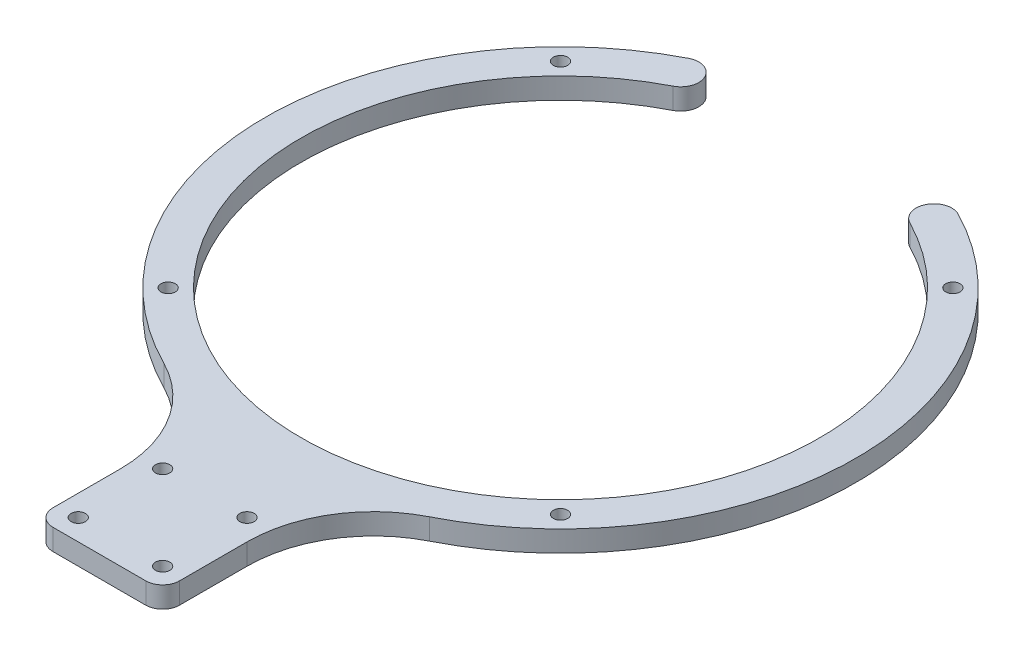
ISO-10303-21;
HEADER;
FILE_DESCRIPTION(('STEP AP214'),'2;1');
FILE_NAME('part.step','',(''),(''),'','','');
FILE_SCHEMA(('AUTOMOTIVE_DESIGN { 1 0 10303 214 1 1 1 1 }'));
ENDSEC;
DATA;
#1=APPLICATION_CONTEXT('core data for automotive mechanical design processes');
#2=APPLICATION_PROTOCOL_DEFINITION('international standard','automotive_design',2000,#1);
#3=PRODUCT_CONTEXT('',#1,'mechanical');
#4=PRODUCT('Part','Part','',(#3));
#5=PRODUCT_RELATED_PRODUCT_CATEGORY('part','',(#4));
#6=PRODUCT_DEFINITION_FORMATION('','',#4);
#7=PRODUCT_DEFINITION_CONTEXT('part definition',#1,'design');
#8=PRODUCT_DEFINITION('design','',#6,#7);
#9=PRODUCT_DEFINITION_SHAPE('','',#8);
#10=(LENGTH_UNIT() NAMED_UNIT(*) SI_UNIT(.MILLI.,.METRE.));
#11=(NAMED_UNIT(*) PLANE_ANGLE_UNIT() SI_UNIT($,.RADIAN.));
#12=(NAMED_UNIT(*) SI_UNIT($,.STERADIAN.) SOLID_ANGLE_UNIT());
#13=UNCERTAINTY_MEASURE_WITH_UNIT(LENGTH_MEASURE(1.E-05),#10,'distance_accuracy_value','');
#14=(GEOMETRIC_REPRESENTATION_CONTEXT(3) GLOBAL_UNCERTAINTY_ASSIGNED_CONTEXT((#13)) GLOBAL_UNIT_ASSIGNED_CONTEXT((#10,
#11,#12)) REPRESENTATION_CONTEXT('',''));
#15=CARTESIAN_POINT('',(0.,0.,0.));
#16=DIRECTION('',(0.,0.,1.));
#17=DIRECTION('',(1.,0.,0.));
#18=AXIS2_PLACEMENT_3D('',#15,#16,#17);
#19=CARTESIAN_POINT('',(-45.,0.,89.3028554974587));
#20=DIRECTION('',(0.,-1.,0.));
#21=DIRECTION('',(0.,0.,-1.));
#22=AXIS2_PLACEMENT_3D('',#19,#20,#21);
#23=PLANE('',#22);
#24=CARTESIAN_POINT('',(46.5,0.,-46.5));
#25=DIRECTION('',(0.,1.,0.));
#26=DIRECTION('',(0.,0.,1.));
#27=AXIS2_PLACEMENT_3D('',#24,#25,#26);
#28=CIRCLE('',#27,1.7);
#29=CARTESIAN_POINT('',(46.5,0.,-44.8));
#30=VERTEX_POINT('',#29);
#31=EDGE_CURVE('E298',#30,#30,#28,.T.);
#32=ORIENTED_EDGE('',*,*,#31,.T.);
#33=EDGE_LOOP('',(#32));
#34=FACE_BOUND('',#33,.T.);
#35=CARTESIAN_POINT('',(46.5,0.,46.5));
#36=DIRECTION('',(0.,1.,0.));
#37=DIRECTION('',(0.,0.,1.));
#38=AXIS2_PLACEMENT_3D('',#35,#36,#37);
#39=CIRCLE('',#38,1.7);
#40=CARTESIAN_POINT('',(46.5,0.,48.2));
#41=VERTEX_POINT('',#40);
#42=EDGE_CURVE('E308',#41,#41,#39,.T.);
#43=ORIENTED_EDGE('',*,*,#42,.T.);
#44=EDGE_LOOP('',(#43));
#45=FACE_BOUND('',#44,.T.);
#46=CARTESIAN_POINT('',(-46.5,0.,46.5));
#47=DIRECTION('',(0.,1.,0.));
#48=DIRECTION('',(0.,0.,1.));
#49=AXIS2_PLACEMENT_3D('',#46,#47,#48);
#50=CIRCLE('',#49,1.7);
#51=CARTESIAN_POINT('',(-46.5,0.,48.2));
#52=VERTEX_POINT('',#51);
#53=EDGE_CURVE('E314',#52,#52,#50,.T.);
#54=ORIENTED_EDGE('',*,*,#53,.T.);
#55=EDGE_LOOP('',(#54));
#56=FACE_BOUND('',#55,.T.);
#57=CARTESIAN_POINT('',(-46.5,0.,-46.5));
#58=DIRECTION('',(0.,1.,0.));
#59=DIRECTION('',(0.,0.,1.));
#60=AXIS2_PLACEMENT_3D('',#57,#58,#59);
#61=CIRCLE('',#60,1.7);
#62=CARTESIAN_POINT('',(-46.5,0.,-44.8));
#63=VERTEX_POINT('',#62);
#64=EDGE_CURVE('E320',#63,#63,#61,.T.);
#65=ORIENTED_EDGE('',*,*,#64,.T.);
#66=EDGE_LOOP('',(#65));
#67=FACE_BOUND('',#66,.T.);
#68=CARTESIAN_POINT('',(-10.,0.,84.3028554974587));
#69=DIRECTION('',(0.,1.,0.));
#70=DIRECTION('',(0.,0.,1.));
#71=AXIS2_PLACEMENT_3D('',#68,#69,#70);
#72=CIRCLE('',#71,1.7);
#73=CARTESIAN_POINT('',(-10.,0.,86.0028554974587));
#74=VERTEX_POINT('',#73);
#75=EDGE_CURVE('E326',#74,#74,#72,.T.);
#76=ORIENTED_EDGE('',*,*,#75,.T.);
#77=EDGE_LOOP('',(#76));
#78=FACE_BOUND('',#77,.T.);
#79=CARTESIAN_POINT('',(10.,0.,84.3028554974587));
#80=DIRECTION('',(0.,1.,0.));
#81=DIRECTION('',(0.,0.,1.));
#82=AXIS2_PLACEMENT_3D('',#79,#80,#81);
#83=CIRCLE('',#82,1.7);
#84=CARTESIAN_POINT('',(10.,0.,86.0028554974587));
#85=VERTEX_POINT('',#84);
#86=EDGE_CURVE('E332',#85,#85,#83,.T.);
#87=ORIENTED_EDGE('',*,*,#86,.T.);
#88=EDGE_LOOP('',(#87));
#89=FACE_BOUND('',#88,.T.);
#90=CARTESIAN_POINT('',(10.,0.,104.302855497459));
#91=DIRECTION('',(0.,1.,0.));
#92=DIRECTION('',(0.,0.,1.));
#93=AXIS2_PLACEMENT_3D('',#90,#91,#92);
#94=CIRCLE('',#93,1.7);
#95=CARTESIAN_POINT('',(10.,0.,106.002855497459));
#96=VERTEX_POINT('',#95);
#97=EDGE_CURVE('E338',#96,#96,#94,.T.);
#98=ORIENTED_EDGE('',*,*,#97,.T.);
#99=EDGE_LOOP('',(#98));
#100=FACE_BOUND('',#99,.T.);
#101=CARTESIAN_POINT('',(-45.,0.,89.3028554974587));
#102=DIRECTION('',(0.,-1.,0.));
#103=DIRECTION('',(0.,0.,-1.));
#104=AXIS2_PLACEMENT_3D('',#101,#102,#103);
#105=CIRCLE('',#104,30.);
#106=CARTESIAN_POINT('',(-31.5,0.,62.5119988482211));
#107=VERTEX_POINT('',#106);
#108=CARTESIAN_POINT('',(-15.,0.,89.3028554974587));
#109=VERTEX_POINT('',#108);
#110=EDGE_CURVE('E153',#107,#109,#105,.T.);
#111=ORIENTED_EDGE('',*,*,#110,.F.);
#112=CARTESIAN_POINT('',(0.,0.,0.));
#113=DIRECTION('',(0.,1.,0.));
#114=DIRECTION('',(0.,0.,1.));
#115=AXIS2_PLACEMENT_3D('',#112,#113,#114);
#116=CIRCLE('',#115,70.);
#117=CARTESIAN_POINT('',(-31.934306569343,0.,-62.2912519053455));
#118=VERTEX_POINT('',#117);
#119=EDGE_CURVE('E96',#118,#107,#116,.T.);
#120=ORIENTED_EDGE('',*,*,#119,.F.);
#121=CARTESIAN_POINT('',(-30.,0.,-58.518181789936));
#122=DIRECTION('',(0.,1.,0.));
#123=DIRECTION('',(0.,0.,-1.));
#124=AXIS2_PLACEMENT_3D('',#121,#122,#123);
#125=CIRCLE('',#124,4.24000000000001);
#126=CARTESIAN_POINT('',(-28.0656934306569,0.,-54.7451116745265));
#127=VERTEX_POINT('',#126);
#128=EDGE_CURVE('E90',#127,#118,#125,.T.);
#129=ORIENTED_EDGE('',*,*,#128,.F.);
#130=CARTESIAN_POINT('',(0.,0.,0.));
#131=DIRECTION('',(0.,-1.,0.));
#132=DIRECTION('',(0.,0.,-1.));
#133=AXIS2_PLACEMENT_3D('',#130,#131,#132);
#134=CIRCLE('',#133,61.52);
#135=CARTESIAN_POINT('',(28.0656934306569,0.,-54.7451116745265));
#136=VERTEX_POINT('',#135);
#137=EDGE_CURVE('E143',#136,#127,#134,.T.);
#138=ORIENTED_EDGE('',*,*,#137,.F.);
#139=CARTESIAN_POINT('',(30.,0.,-58.518181789936));
#140=DIRECTION('',(0.,1.,0.));
#141=DIRECTION('',(0.,0.,-1.));
#142=AXIS2_PLACEMENT_3D('',#139,#140,#141);
#143=CIRCLE('',#142,4.24000000000001);
#144=CARTESIAN_POINT('',(31.9343065693431,0.,-62.2912519053455));
#145=VERTEX_POINT('',#144);
#146=EDGE_CURVE('E171',#145,#136,#143,.T.);
#147=ORIENTED_EDGE('',*,*,#146,.F.);
#148=CARTESIAN_POINT('',(0.,0.,0.));
#149=DIRECTION('',(0.,1.,0.));
#150=DIRECTION('',(0.,0.,-1.));
#151=AXIS2_PLACEMENT_3D('',#148,#149,#150);
#152=CIRCLE('',#151,70.);
#153=CARTESIAN_POINT('',(31.5,0.,62.5119988482211));
#154=VERTEX_POINT('',#153);
#155=EDGE_CURVE('E169',#154,#145,#152,.T.);
#156=ORIENTED_EDGE('',*,*,#155,.F.);
#157=CARTESIAN_POINT('',(45.,0.,89.3028554974587));
#158=DIRECTION('',(0.,-1.,0.));
#159=DIRECTION('',(0.,0.,1.));
#160=AXIS2_PLACEMENT_3D('',#157,#158,#159);
#161=CIRCLE('',#160,30.);
#162=CARTESIAN_POINT('',(15.,0.,89.3028554974587));
#163=VERTEX_POINT('',#162);
#164=EDGE_CURVE('E167',#163,#154,#161,.T.);
#165=ORIENTED_EDGE('',*,*,#164,.F.);
#166=DIRECTION('',(0.,0.,-1.));
#167=VECTOR('',#166,1.);
#168=CARTESIAN_POINT('',(15.,0.,89.3028554974587));
#169=LINE('',#168,#167);
#170=CARTESIAN_POINT('',(15.,0.,105.302855497459));
#171=VERTEX_POINT('',#170);
#172=EDGE_CURVE('E165',#171,#163,#169,.T.);
#173=ORIENTED_EDGE('',*,*,#172,.F.);
#174=CARTESIAN_POINT('',(11.,0.,105.302855497459));
#175=DIRECTION('',(0.,1.,0.));
#176=DIRECTION('',(0.,0.,-1.));
#177=AXIS2_PLACEMENT_3D('',#174,#175,#176);
#178=CIRCLE('',#177,4.00000000000001);
#179=CARTESIAN_POINT('',(11.,0.,109.302855497459));
#180=VERTEX_POINT('',#179);
#181=EDGE_CURVE('E163',#180,#171,#178,.T.);
#182=ORIENTED_EDGE('',*,*,#181,.F.);
#183=DIRECTION('',(1.,0.,0.));
#184=VECTOR('',#183,1.);
#185=CARTESIAN_POINT('',(11.,0.,109.302855497459));
#186=LINE('',#185,#184);
#187=CARTESIAN_POINT('',(-11.,0.,109.302855497459));
#188=VERTEX_POINT('',#187);
#189=EDGE_CURVE('E161',#188,#180,#186,.T.);
#190=ORIENTED_EDGE('',*,*,#189,.F.);
#191=CARTESIAN_POINT('',(-11.,0.,105.302855497459));
#192=DIRECTION('',(0.,1.,0.));
#193=DIRECTION('',(0.,0.,1.));
#194=AXIS2_PLACEMENT_3D('',#191,#192,#193);
#195=CIRCLE('',#194,4.);
#196=CARTESIAN_POINT('',(-15.,0.,105.302855497459));
#197=VERTEX_POINT('',#196);
#198=EDGE_CURVE('E159',#197,#188,#195,.T.);
#199=ORIENTED_EDGE('',*,*,#198,.F.);
#200=DIRECTION('',(0.,0.,1.));
#201=VECTOR('',#200,1.);
#202=CARTESIAN_POINT('',(-15.,0.,89.3028554974587));
#203=LINE('',#202,#201);
#204=EDGE_CURVE('E156',#109,#197,#203,.T.);
#205=ORIENTED_EDGE('',*,*,#204,.F.);
#206=EDGE_LOOP('',(#111,#120,#129,#138,#147,#156,#165,#173,#182,#190,#199,#205));
#207=FACE_BOUND('',#206,.T.);
#208=CARTESIAN_POINT('',(-10.,0.,104.302855497459));
#209=DIRECTION('',(0.,1.,0.));
#210=DIRECTION('',(0.,0.,1.));
#211=AXIS2_PLACEMENT_3D('',#208,#209,#210);
#212=CIRCLE('',#211,1.7);
#213=CARTESIAN_POINT('',(-10.,0.,106.002855497459));
#214=VERTEX_POINT('',#213);
#215=EDGE_CURVE('E157',#214,#214,#212,.T.);
#216=ORIENTED_EDGE('',*,*,#215,.T.);
#217=EDGE_LOOP('',(#216));
#218=FACE_BOUND('',#217,.T.);
#219=ADVANCED_FACE('F32',(#34,#45,#56,#67,#78,#89,#100,#207,#218),#23,.T.);
#220=CARTESIAN_POINT('',(-45.,4.99999999999999,89.3028554974587));
#221=DIRECTION('',(0.,-1.,0.));
#222=DIRECTION('',(0.,0.,-1.));
#223=AXIS2_PLACEMENT_3D('',#220,#221,#222);
#224=CYLINDRICAL_SURFACE('',#223,30.);
#225=ORIENTED_EDGE('',*,*,#110,.T.);
#226=DIRECTION('',(0.,-1.,0.));
#227=VECTOR('',#226,1.);
#228=CARTESIAN_POINT('',(-15.,4.99999999999999,89.3028554974587));
#229=LINE('',#228,#227);
#230=CARTESIAN_POINT('',(-15.,4.99999999999999,89.3028554974587));
#231=VERTEX_POINT('',#230);
#232=EDGE_CURVE('E11',#231,#109,#229,.T.);
#233=ORIENTED_EDGE('',*,*,#232,.F.);
#234=CARTESIAN_POINT('',(-45.,4.99999999999999,89.3028554974587));
#235=DIRECTION('',(0.,-1.,0.));
#236=DIRECTION('',(0.,0.,-1.));
#237=AXIS2_PLACEMENT_3D('',#234,#235,#236);
#238=CIRCLE('',#237,30.);
#239=CARTESIAN_POINT('',(-31.5,5.,62.5119988482211));
#240=VERTEX_POINT('',#239);
#241=EDGE_CURVE('E176',#240,#231,#238,.T.);
#242=ORIENTED_EDGE('',*,*,#241,.F.);
#243=DIRECTION('',(0.,-1.,0.));
#244=VECTOR('',#243,1.);
#245=CARTESIAN_POINT('',(-31.5,5.,62.5119988482211));
#246=LINE('',#245,#244);
#247=EDGE_CURVE('E149',#240,#107,#246,.T.);
#248=ORIENTED_EDGE('',*,*,#247,.T.);
#249=EDGE_LOOP('',(#225,#233,#242,#248));
#250=FACE_BOUND('',#249,.T.);
#251=ADVANCED_FACE('F34',(#250),#224,.F.);
#252=CARTESIAN_POINT('',(-15.,4.99999999999999,89.3028554974587));
#253=DIRECTION('',(1.,0.,0.));
#254=DIRECTION('',(0.,0.,-1.));
#255=AXIS2_PLACEMENT_3D('',#252,#253,#254);
#256=PLANE('',#255);
#257=ORIENTED_EDGE('',*,*,#204,.T.);
#258=DIRECTION('',(0.,-1.,0.));
#259=VECTOR('',#258,1.);
#260=CARTESIAN_POINT('',(-15.,4.99999999999996,105.302855497459));
#261=LINE('',#260,#259);
#262=CARTESIAN_POINT('',(-15.,4.99999999999996,105.302855497459));
#263=VERTEX_POINT('',#262);
#264=EDGE_CURVE('E41',#263,#197,#261,.T.);
#265=ORIENTED_EDGE('',*,*,#264,.F.);
#266=DIRECTION('',(0.,0.,1.));
#267=VECTOR('',#266,1.);
#268=CARTESIAN_POINT('',(-15.,4.99999999999999,89.3028554974587));
#269=LINE('',#268,#267);
#270=EDGE_CURVE('E104',#231,#263,#269,.T.);
#271=ORIENTED_EDGE('',*,*,#270,.F.);
#272=ORIENTED_EDGE('',*,*,#232,.T.);
#273=EDGE_LOOP('',(#257,#265,#271,#272));
#274=FACE_BOUND('',#273,.T.);
#275=ADVANCED_FACE('F260',(#274),#256,.F.);
#276=CARTESIAN_POINT('',(-11.,4.99999999999996,105.302855497459));
#277=DIRECTION('',(0.,-1.,0.));
#278=DIRECTION('',(0.,0.,-1.));
#279=AXIS2_PLACEMENT_3D('',#276,#277,#278);
#280=CYLINDRICAL_SURFACE('',#279,4.);
#281=ORIENTED_EDGE('',*,*,#198,.T.);
#282=DIRECTION('',(0.,-1.,0.));
#283=VECTOR('',#282,1.);
#284=CARTESIAN_POINT('',(-11.,4.99999999999998,109.302855497459));
#285=LINE('',#284,#283);
#286=CARTESIAN_POINT('',(-11.,4.99999999999998,109.302855497459));
#287=VERTEX_POINT('',#286);
#288=EDGE_CURVE('E195',#287,#188,#285,.T.);
#289=ORIENTED_EDGE('',*,*,#288,.F.);
#290=CARTESIAN_POINT('',(-11.,4.99999999999996,105.302855497459));
#291=DIRECTION('',(0.,1.,0.));
#292=DIRECTION('',(0.,0.,1.));
#293=AXIS2_PLACEMENT_3D('',#290,#291,#292);
#294=CIRCLE('',#293,4.);
#295=EDGE_CURVE('E203',#263,#287,#294,.T.);
#296=ORIENTED_EDGE('',*,*,#295,.F.);
#297=ORIENTED_EDGE('',*,*,#264,.T.);
#298=EDGE_LOOP('',(#281,#289,#296,#297));
#299=FACE_BOUND('',#298,.T.);
#300=ADVANCED_FACE('F201',(#299),#280,.T.);
#301=CARTESIAN_POINT('',(11.,4.99999999999998,109.302855497459));
#302=DIRECTION('',(0.,0.,-1.));
#303=DIRECTION('',(-1.,0.,0.));
#304=AXIS2_PLACEMENT_3D('',#301,#302,#303);
#305=PLANE('',#304);
#306=ORIENTED_EDGE('',*,*,#189,.T.);
#307=DIRECTION('',(0.,-1.,0.));
#308=VECTOR('',#307,1.);
#309=CARTESIAN_POINT('',(11.,4.99999999999998,109.302855497459));
#310=LINE('',#309,#308);
#311=CARTESIAN_POINT('',(11.,4.99999999999998,109.302855497459));
#312=VERTEX_POINT('',#311);
#313=EDGE_CURVE('E192',#312,#180,#310,.T.);
#314=ORIENTED_EDGE('',*,*,#313,.F.);
#315=DIRECTION('',(1.,0.,0.));
#316=VECTOR('',#315,1.);
#317=CARTESIAN_POINT('',(11.,4.99999999999998,109.302855497459));
#318=LINE('',#317,#316);
#319=EDGE_CURVE('E221',#287,#312,#318,.T.);
#320=ORIENTED_EDGE('',*,*,#319,.F.);
#321=ORIENTED_EDGE('',*,*,#288,.T.);
#322=EDGE_LOOP('',(#306,#314,#320,#321));
#323=FACE_BOUND('',#322,.T.);
#324=ADVANCED_FACE('F212',(#323),#305,.F.);
#325=CARTESIAN_POINT('',(11.,4.99999999999996,105.302855497459));
#326=DIRECTION('',(0.,-1.,0.));
#327=DIRECTION('',(0.,0.,-1.));
#328=AXIS2_PLACEMENT_3D('',#325,#326,#327);
#329=CYLINDRICAL_SURFACE('',#328,4.00000000000001);
#330=ORIENTED_EDGE('',*,*,#181,.T.);
#331=DIRECTION('',(0.,-1.,0.));
#332=VECTOR('',#331,1.);
#333=CARTESIAN_POINT('',(15.,4.99999999999996,105.302855497459));
#334=LINE('',#333,#332);
#335=CARTESIAN_POINT('',(15.,4.99999999999996,105.302855497459));
#336=VERTEX_POINT('',#335);
#337=EDGE_CURVE('E189',#336,#171,#334,.T.);
#338=ORIENTED_EDGE('',*,*,#337,.F.);
#339=CARTESIAN_POINT('',(11.,4.99999999999996,105.302855497459));
#340=DIRECTION('',(0.,1.,0.));
#341=DIRECTION('',(0.,0.,-1.));
#342=AXIS2_PLACEMENT_3D('',#339,#340,#341);
#343=CIRCLE('',#342,4.00000000000001);
#344=EDGE_CURVE('E218',#312,#336,#343,.T.);
#345=ORIENTED_EDGE('',*,*,#344,.F.);
#346=ORIENTED_EDGE('',*,*,#313,.T.);
#347=EDGE_LOOP('',(#330,#338,#345,#346));
#348=FACE_BOUND('',#347,.T.);
#349=ADVANCED_FACE('F216',(#348),#329,.T.);
#350=CARTESIAN_POINT('',(15.,4.99999999999999,89.3028554974587));
#351=DIRECTION('',(-1.,0.,0.));
#352=DIRECTION('',(0.,0.,1.));
#353=AXIS2_PLACEMENT_3D('',#350,#351,#352);
#354=PLANE('',#353);
#355=ORIENTED_EDGE('',*,*,#172,.T.);
#356=DIRECTION('',(0.,-1.,0.));
#357=VECTOR('',#356,1.);
#358=CARTESIAN_POINT('',(15.,4.99999999999999,89.3028554974587));
#359=LINE('',#358,#357);
#360=CARTESIAN_POINT('',(15.,4.99999999999999,89.3028554974587));
#361=VERTEX_POINT('',#360);
#362=EDGE_CURVE('E186',#361,#163,#359,.T.);
#363=ORIENTED_EDGE('',*,*,#362,.F.);
#364=DIRECTION('',(0.,0.,-1.));
#365=VECTOR('',#364,1.);
#366=CARTESIAN_POINT('',(15.,4.99999999999999,89.3028554974587));
#367=LINE('',#366,#365);
#368=EDGE_CURVE('E220',#336,#361,#367,.T.);
#369=ORIENTED_EDGE('',*,*,#368,.F.);
#370=ORIENTED_EDGE('',*,*,#337,.T.);
#371=EDGE_LOOP('',(#355,#363,#369,#370));
#372=FACE_BOUND('',#371,.T.);
#373=ADVANCED_FACE('F446',(#372),#354,.F.);
#374=CARTESIAN_POINT('',(45.,4.99999999999999,89.3028554974587));
#375=DIRECTION('',(0.,-1.,0.));
#376=DIRECTION('',(0.,0.,-1.));
#377=AXIS2_PLACEMENT_3D('',#374,#375,#376);
#378=CYLINDRICAL_SURFACE('',#377,30.);
#379=ORIENTED_EDGE('',*,*,#164,.T.);
#380=DIRECTION('',(0.,-1.,0.));
#381=VECTOR('',#380,1.);
#382=CARTESIAN_POINT('',(31.5,5.,62.5119988482211));
#383=LINE('',#382,#381);
#384=CARTESIAN_POINT('',(31.5,5.,62.5119988482211));
#385=VERTEX_POINT('',#384);
#386=EDGE_CURVE('E183',#385,#154,#383,.T.);
#387=ORIENTED_EDGE('',*,*,#386,.F.);
#388=CARTESIAN_POINT('',(45.,4.99999999999999,89.3028554974587));
#389=DIRECTION('',(0.,-1.,0.));
#390=DIRECTION('',(0.,0.,1.));
#391=AXIS2_PLACEMENT_3D('',#388,#389,#390);
#392=CIRCLE('',#391,30.);
#393=EDGE_CURVE('E223',#361,#385,#392,.T.);
#394=ORIENTED_EDGE('',*,*,#393,.F.);
#395=ORIENTED_EDGE('',*,*,#362,.T.);
#396=EDGE_LOOP('',(#379,#387,#394,#395));
#397=FACE_BOUND('',#396,.T.);
#398=ADVANCED_FACE('F439',(#397),#378,.F.);
#399=CARTESIAN_POINT('',(0.,5.,0.));
#400=DIRECTION('',(0.,-1.,0.));
#401=DIRECTION('',(0.,0.,-1.));
#402=AXIS2_PLACEMENT_3D('',#399,#400,#401);
#403=CYLINDRICAL_SURFACE('',#402,70.);
#404=ORIENTED_EDGE('',*,*,#155,.T.);
#405=DIRECTION('',(0.,-1.,0.));
#406=VECTOR('',#405,1.);
#407=CARTESIAN_POINT('',(31.9343065693431,5.,-62.2912519053456));
#408=LINE('',#407,#406);
#409=CARTESIAN_POINT('',(31.9343065693431,5.,-62.2912519053456));
#410=VERTEX_POINT('',#409);
#411=EDGE_CURVE('E180',#410,#145,#408,.T.);
#412=ORIENTED_EDGE('',*,*,#411,.F.);
#413=CARTESIAN_POINT('',(0.,5.,0.));
#414=DIRECTION('',(0.,1.,0.));
#415=DIRECTION('',(0.,0.,-1.));
#416=AXIS2_PLACEMENT_3D('',#413,#414,#415);
#417=CIRCLE('',#416,70.);
#418=EDGE_CURVE('E229',#385,#410,#417,.T.);
#419=ORIENTED_EDGE('',*,*,#418,.F.);
#420=ORIENTED_EDGE('',*,*,#386,.T.);
#421=EDGE_LOOP('',(#404,#412,#419,#420));
#422=FACE_BOUND('',#421,.T.);
#423=ADVANCED_FACE('F235',(#422),#403,.T.);
#424=CARTESIAN_POINT('',(30.,5.,-58.518181789936));
#425=DIRECTION('',(0.,-1.,0.));
#426=DIRECTION('',(0.,0.,-1.));
#427=AXIS2_PLACEMENT_3D('',#424,#425,#426);
#428=CYLINDRICAL_SURFACE('',#427,4.24000000000001);
#429=ORIENTED_EDGE('',*,*,#146,.T.);
#430=DIRECTION('',(0.,-1.,0.));
#431=VECTOR('',#430,1.);
#432=CARTESIAN_POINT('',(28.0656934306569,5.,-54.7451116745265));
#433=LINE('',#432,#431);
#434=CARTESIAN_POINT('',(28.0656934306569,5.,-54.7451116745265));
#435=VERTEX_POINT('',#434);
#436=EDGE_CURVE('E144',#435,#136,#433,.T.);
#437=ORIENTED_EDGE('',*,*,#436,.F.);
#438=CARTESIAN_POINT('',(30.,5.,-58.518181789936));
#439=DIRECTION('',(0.,1.,0.));
#440=DIRECTION('',(0.,0.,-1.));
#441=AXIS2_PLACEMENT_3D('',#438,#439,#440);
#442=CIRCLE('',#441,4.24000000000001);
#443=EDGE_CURVE('E135',#410,#435,#442,.T.);
#444=ORIENTED_EDGE('',*,*,#443,.F.);
#445=ORIENTED_EDGE('',*,*,#411,.T.);
#446=EDGE_LOOP('',(#429,#437,#444,#445));
#447=FACE_BOUND('',#446,.T.);
#448=ADVANCED_FACE('F239',(#447),#428,.T.);
#449=CARTESIAN_POINT('',(0.,5.,0.));
#450=DIRECTION('',(0.,-1.,0.));
#451=DIRECTION('',(0.,0.,-1.));
#452=AXIS2_PLACEMENT_3D('',#449,#450,#451);
#453=CYLINDRICAL_SURFACE('',#452,61.52);
#454=ORIENTED_EDGE('',*,*,#137,.T.);
#455=DIRECTION('',(0.,-1.,0.));
#456=VECTOR('',#455,1.);
#457=CARTESIAN_POINT('',(-28.0656934306569,5.,-54.7451116745265));
#458=LINE('',#457,#456);
#459=CARTESIAN_POINT('',(-28.0656934306569,5.,-54.7451116745265));
#460=VERTEX_POINT('',#459);
#461=EDGE_CURVE('E140',#460,#127,#458,.T.);
#462=ORIENTED_EDGE('',*,*,#461,.F.);
#463=CARTESIAN_POINT('',(0.,5.,0.));
#464=DIRECTION('',(0.,-1.,0.));
#465=DIRECTION('',(0.,0.,-1.));
#466=AXIS2_PLACEMENT_3D('',#463,#464,#465);
#467=CIRCLE('',#466,61.52);
#468=EDGE_CURVE('E129',#435,#460,#467,.T.);
#469=ORIENTED_EDGE('',*,*,#468,.F.);
#470=ORIENTED_EDGE('',*,*,#436,.T.);
#471=EDGE_LOOP('',(#454,#462,#469,#470));
#472=FACE_BOUND('',#471,.T.);
#473=ADVANCED_FACE('F141',(#472),#453,.F.);
#474=CARTESIAN_POINT('',(-30.,5.,-58.518181789936));
#475=DIRECTION('',(0.,-1.,0.));
#476=DIRECTION('',(0.,0.,-1.));
#477=AXIS2_PLACEMENT_3D('',#474,#475,#476);
#478=CYLINDRICAL_SURFACE('',#477,4.24000000000001);
#479=ORIENTED_EDGE('',*,*,#128,.T.);
#480=DIRECTION('',(0.,-1.,0.));
#481=VECTOR('',#480,1.);
#482=CARTESIAN_POINT('',(-31.934306569343,5.,-62.2912519053455));
#483=LINE('',#482,#481);
#484=CARTESIAN_POINT('',(-31.934306569343,5.,-62.2912519053455));
#485=VERTEX_POINT('',#484);
#486=EDGE_CURVE('E145',#485,#118,#483,.T.);
#487=ORIENTED_EDGE('',*,*,#486,.F.);
#488=CARTESIAN_POINT('',(-30.,5.,-58.518181789936));
#489=DIRECTION('',(0.,1.,0.));
#490=DIRECTION('',(0.,0.,-1.));
#491=AXIS2_PLACEMENT_3D('',#488,#489,#490);
#492=CIRCLE('',#491,4.24000000000001);
#493=EDGE_CURVE('E133',#460,#485,#492,.T.);
#494=ORIENTED_EDGE('',*,*,#493,.F.);
#495=ORIENTED_EDGE('',*,*,#461,.T.);
#496=EDGE_LOOP('',(#479,#487,#494,#495));
#497=FACE_BOUND('',#496,.T.);
#498=ADVANCED_FACE('F147',(#497),#478,.T.);
#499=CARTESIAN_POINT('',(0.,5.,0.));
#500=DIRECTION('',(0.,-1.,0.));
#501=DIRECTION('',(0.,0.,-1.));
#502=AXIS2_PLACEMENT_3D('',#499,#500,#501);
#503=CYLINDRICAL_SURFACE('',#502,70.);
#504=ORIENTED_EDGE('',*,*,#119,.T.);
#505=ORIENTED_EDGE('',*,*,#247,.F.);
#506=CARTESIAN_POINT('',(0.,5.,0.));
#507=DIRECTION('',(0.,1.,0.));
#508=DIRECTION('',(0.,0.,1.));
#509=AXIS2_PLACEMENT_3D('',#506,#507,#508);
#510=CIRCLE('',#509,70.);
#511=EDGE_CURVE('E49',#485,#240,#510,.T.);
#512=ORIENTED_EDGE('',*,*,#511,.F.);
#513=ORIENTED_EDGE('',*,*,#486,.T.);
#514=EDGE_LOOP('',(#504,#505,#512,#513));
#515=FACE_BOUND('',#514,.T.);
#516=ADVANCED_FACE('F243',(#515),#503,.T.);
#517=CARTESIAN_POINT('',(-45.,4.99999999999999,89.3028554974587));
#518=DIRECTION('',(0.,-1.,0.));
#519=DIRECTION('',(0.,0.,-1.));
#520=AXIS2_PLACEMENT_3D('',#517,#518,#519);
#521=PLANE('',#520);
#522=CARTESIAN_POINT('',(46.5,5.,-46.5));
#523=DIRECTION('',(0.,1.,0.));
#524=DIRECTION('',(0.,0.,1.));
#525=AXIS2_PLACEMENT_3D('',#522,#523,#524);
#526=CIRCLE('',#525,1.69999999999999);
#527=CARTESIAN_POINT('',(46.5,5.,-44.8));
#528=VERTEX_POINT('',#527);
#529=EDGE_CURVE('E301',#528,#528,#526,.T.);
#530=ORIENTED_EDGE('',*,*,#529,.F.);
#531=EDGE_LOOP('',(#530));
#532=FACE_BOUND('',#531,.T.);
#533=CARTESIAN_POINT('',(46.5,5.,46.5));
#534=DIRECTION('',(0.,1.,0.));
#535=DIRECTION('',(0.,0.,1.));
#536=AXIS2_PLACEMENT_3D('',#533,#534,#535);
#537=CIRCLE('',#536,1.69999999999999);
#538=CARTESIAN_POINT('',(46.5,5.,48.2));
#539=VERTEX_POINT('',#538);
#540=EDGE_CURVE('E303',#539,#539,#537,.T.);
#541=ORIENTED_EDGE('',*,*,#540,.F.);
#542=EDGE_LOOP('',(#541));
#543=FACE_BOUND('',#542,.T.);
#544=CARTESIAN_POINT('',(-46.5,5.,46.5));
#545=DIRECTION('',(0.,1.,0.));
#546=DIRECTION('',(0.,0.,1.));
#547=AXIS2_PLACEMENT_3D('',#544,#545,#546);
#548=CIRCLE('',#547,1.69999999999999);
#549=CARTESIAN_POINT('',(-46.5,5.,48.2));
#550=VERTEX_POINT('',#549);
#551=EDGE_CURVE('E311',#550,#550,#548,.T.);
#552=ORIENTED_EDGE('',*,*,#551,.F.);
#553=EDGE_LOOP('',(#552));
#554=FACE_BOUND('',#553,.T.);
#555=CARTESIAN_POINT('',(-46.5,5.,-46.5));
#556=DIRECTION('',(0.,1.,0.));
#557=DIRECTION('',(0.,0.,1.));
#558=AXIS2_PLACEMENT_3D('',#555,#556,#557);
#559=CIRCLE('',#558,1.69999999999999);
#560=CARTESIAN_POINT('',(-46.5,5.,-44.8));
#561=VERTEX_POINT('',#560);
#562=EDGE_CURVE('E317',#561,#561,#559,.T.);
#563=ORIENTED_EDGE('',*,*,#562,.F.);
#564=EDGE_LOOP('',(#563));
#565=FACE_BOUND('',#564,.T.);
#566=CARTESIAN_POINT('',(-10.,5.,84.3028554974587));
#567=DIRECTION('',(0.,1.,0.));
#568=DIRECTION('',(0.,0.,1.));
#569=AXIS2_PLACEMENT_3D('',#566,#567,#568);
#570=CIRCLE('',#569,1.69999999999999);
#571=CARTESIAN_POINT('',(-10.,5.,86.0028554974587));
#572=VERTEX_POINT('',#571);
#573=EDGE_CURVE('E323',#572,#572,#570,.T.);
#574=ORIENTED_EDGE('',*,*,#573,.F.);
#575=EDGE_LOOP('',(#574));
#576=FACE_BOUND('',#575,.T.);
#577=CARTESIAN_POINT('',(10.,5.,84.3028554974587));
#578=DIRECTION('',(0.,1.,0.));
#579=DIRECTION('',(0.,0.,1.));
#580=AXIS2_PLACEMENT_3D('',#577,#578,#579);
#581=CIRCLE('',#580,1.69999999999999);
#582=CARTESIAN_POINT('',(10.,5.,86.0028554974587));
#583=VERTEX_POINT('',#582);
#584=EDGE_CURVE('E329',#583,#583,#581,.T.);
#585=ORIENTED_EDGE('',*,*,#584,.F.);
#586=EDGE_LOOP('',(#585));
#587=FACE_BOUND('',#586,.T.);
#588=CARTESIAN_POINT('',(10.,5.,104.302855497459));
#589=DIRECTION('',(0.,1.,0.));
#590=DIRECTION('',(0.,0.,1.));
#591=AXIS2_PLACEMENT_3D('',#588,#589,#590);
#592=CIRCLE('',#591,1.69999999999999);
#593=CARTESIAN_POINT('',(10.,5.,106.002855497459));
#594=VERTEX_POINT('',#593);
#595=EDGE_CURVE('E335',#594,#594,#592,.T.);
#596=ORIENTED_EDGE('',*,*,#595,.F.);
#597=EDGE_LOOP('',(#596));
#598=FACE_BOUND('',#597,.T.);
#599=CARTESIAN_POINT('',(-10.,5.,104.302855497459));
#600=DIRECTION('',(0.,1.,0.));
#601=DIRECTION('',(0.,0.,1.));
#602=AXIS2_PLACEMENT_3D('',#599,#600,#601);
#603=CIRCLE('',#602,1.69999999999999);
#604=CARTESIAN_POINT('',(-10.,5.,106.002855497459));
#605=VERTEX_POINT('',#604);
#606=EDGE_CURVE('E341',#605,#605,#603,.T.);
#607=ORIENTED_EDGE('',*,*,#606,.F.);
#608=EDGE_LOOP('',(#607));
#609=FACE_BOUND('',#608,.T.);
#610=ORIENTED_EDGE('',*,*,#241,.T.);
#611=ORIENTED_EDGE('',*,*,#270,.T.);
#612=ORIENTED_EDGE('',*,*,#295,.T.);
#613=ORIENTED_EDGE('',*,*,#319,.T.);
#614=ORIENTED_EDGE('',*,*,#344,.T.);
#615=ORIENTED_EDGE('',*,*,#368,.T.);
#616=ORIENTED_EDGE('',*,*,#393,.T.);
#617=ORIENTED_EDGE('',*,*,#418,.T.);
#618=ORIENTED_EDGE('',*,*,#443,.T.);
#619=ORIENTED_EDGE('',*,*,#468,.T.);
#620=ORIENTED_EDGE('',*,*,#493,.T.);
#621=ORIENTED_EDGE('',*,*,#511,.T.);
#622=EDGE_LOOP('',(#610,#611,#612,#613,#614,#615,#616,#617,#618,#619,#620,#621));
#623=FACE_BOUND('',#622,.T.);
#624=ADVANCED_FACE('F131',(#532,#543,#554,#565,#576,#587,#598,#609,#623),#521,.F.);
#625=CARTESIAN_POINT('',(-10.,5.,104.302855497459));
#626=DIRECTION('',(0.,1.,0.));
#627=DIRECTION('',(0.,0.,1.));
#628=AXIS2_PLACEMENT_3D('',#625,#626,#627);
#629=CYLINDRICAL_SURFACE('',#628,1.69999999999999);
#630=ORIENTED_EDGE('',*,*,#215,.F.);
#631=EDGE_LOOP('',(#630));
#632=FACE_BOUND('',#631,.T.);
#633=ORIENTED_EDGE('',*,*,#606,.T.);
#634=EDGE_LOOP('',(#633));
#635=FACE_BOUND('',#634,.T.);
#636=ADVANCED_FACE('F250',(#632,#635),#629,.F.);
#637=CARTESIAN_POINT('',(10.,5.,104.302855497459));
#638=DIRECTION('',(0.,1.,0.));
#639=DIRECTION('',(0.,0.,1.));
#640=AXIS2_PLACEMENT_3D('',#637,#638,#639);
#641=CYLINDRICAL_SURFACE('',#640,1.69999999999999);
#642=ORIENTED_EDGE('',*,*,#97,.F.);
#643=EDGE_LOOP('',(#642));
#644=FACE_BOUND('',#643,.T.);
#645=ORIENTED_EDGE('',*,*,#595,.T.);
#646=EDGE_LOOP('',(#645));
#647=FACE_BOUND('',#646,.T.);
#648=ADVANCED_FACE('F266',(#644,#647),#641,.F.);
#649=CARTESIAN_POINT('',(10.,5.,84.3028554974587));
#650=DIRECTION('',(0.,1.,0.));
#651=DIRECTION('',(0.,0.,1.));
#652=AXIS2_PLACEMENT_3D('',#649,#650,#651);
#653=CYLINDRICAL_SURFACE('',#652,1.69999999999999);
#654=ORIENTED_EDGE('',*,*,#86,.F.);
#655=EDGE_LOOP('',(#654));
#656=FACE_BOUND('',#655,.T.);
#657=ORIENTED_EDGE('',*,*,#584,.T.);
#658=EDGE_LOOP('',(#657));
#659=FACE_BOUND('',#658,.T.);
#660=ADVANCED_FACE('F270',(#656,#659),#653,.F.);
#661=CARTESIAN_POINT('',(-10.,5.,84.3028554974587));
#662=DIRECTION('',(0.,1.,0.));
#663=DIRECTION('',(0.,0.,1.));
#664=AXIS2_PLACEMENT_3D('',#661,#662,#663);
#665=CYLINDRICAL_SURFACE('',#664,1.69999999999999);
#666=ORIENTED_EDGE('',*,*,#75,.F.);
#667=EDGE_LOOP('',(#666));
#668=FACE_BOUND('',#667,.T.);
#669=ORIENTED_EDGE('',*,*,#573,.T.);
#670=EDGE_LOOP('',(#669));
#671=FACE_BOUND('',#670,.T.);
#672=ADVANCED_FACE('F274',(#668,#671),#665,.F.);
#673=CARTESIAN_POINT('',(-46.5,5.,-46.5));
#674=DIRECTION('',(0.,1.,0.));
#675=DIRECTION('',(0.,0.,1.));
#676=AXIS2_PLACEMENT_3D('',#673,#674,#675);
#677=CYLINDRICAL_SURFACE('',#676,1.69999999999999);
#678=ORIENTED_EDGE('',*,*,#64,.F.);
#679=EDGE_LOOP('',(#678));
#680=FACE_BOUND('',#679,.T.);
#681=ORIENTED_EDGE('',*,*,#562,.T.);
#682=EDGE_LOOP('',(#681));
#683=FACE_BOUND('',#682,.T.);
#684=ADVANCED_FACE('F278',(#680,#683),#677,.F.);
#685=CARTESIAN_POINT('',(-46.5,5.,46.5));
#686=DIRECTION('',(0.,1.,0.));
#687=DIRECTION('',(0.,0.,1.));
#688=AXIS2_PLACEMENT_3D('',#685,#686,#687);
#689=CYLINDRICAL_SURFACE('',#688,1.69999999999999);
#690=ORIENTED_EDGE('',*,*,#53,.F.);
#691=EDGE_LOOP('',(#690));
#692=FACE_BOUND('',#691,.T.);
#693=ORIENTED_EDGE('',*,*,#551,.T.);
#694=EDGE_LOOP('',(#693));
#695=FACE_BOUND('',#694,.T.);
#696=ADVANCED_FACE('F282',(#692,#695),#689,.F.);
#697=CARTESIAN_POINT('',(46.5,5.,46.5));
#698=DIRECTION('',(0.,1.,0.));
#699=DIRECTION('',(0.,0.,1.));
#700=AXIS2_PLACEMENT_3D('',#697,#698,#699);
#701=CYLINDRICAL_SURFACE('',#700,1.69999999999999);
#702=ORIENTED_EDGE('',*,*,#42,.F.);
#703=EDGE_LOOP('',(#702));
#704=FACE_BOUND('',#703,.T.);
#705=ORIENTED_EDGE('',*,*,#540,.T.);
#706=EDGE_LOOP('',(#705));
#707=FACE_BOUND('',#706,.T.);
#708=ADVANCED_FACE('F286',(#704,#707),#701,.F.);
#709=CARTESIAN_POINT('',(46.5,5.,-46.5));
#710=DIRECTION('',(0.,1.,0.));
#711=DIRECTION('',(0.,0.,1.));
#712=AXIS2_PLACEMENT_3D('',#709,#710,#711);
#713=CYLINDRICAL_SURFACE('',#712,1.69999999999999);
#714=ORIENTED_EDGE('',*,*,#31,.F.);
#715=EDGE_LOOP('',(#714));
#716=FACE_BOUND('',#715,.T.);
#717=ORIENTED_EDGE('',*,*,#529,.T.);
#718=EDGE_LOOP('',(#717));
#719=FACE_BOUND('',#718,.T.);
#720=ADVANCED_FACE('F290',(#716,#719),#713,.F.);
#721=CLOSED_SHELL('',(#219,#251,#275,#300,#324,#349,#373,#398,#423,#448,#473,#498,#516,#624,
#636,#648,#660,#672,#684,#696,#708,#720));
#722=MANIFOLD_SOLID_BREP('B2',#721);
#723=ADVANCED_BREP_SHAPE_REPRESENTATION('',(#18,#722),#14);
#724=SHAPE_DEFINITION_REPRESENTATION(#9,#723);
ENDSEC;
END-ISO-10303-21;
